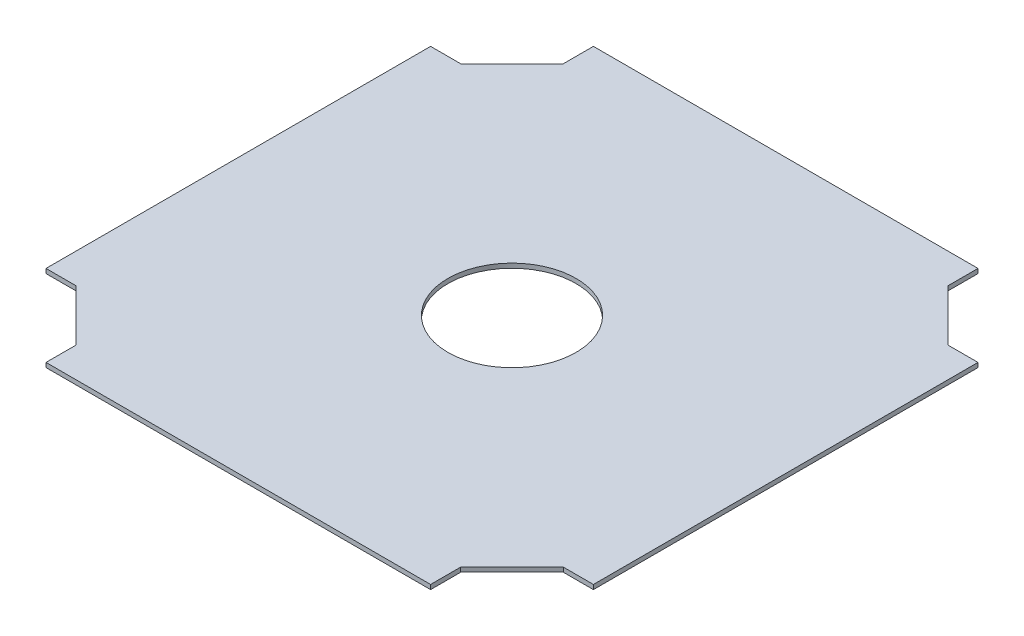
ISO-10303-21;
HEADER;
FILE_DESCRIPTION(('STEP AP214'),'2;1');
FILE_NAME('part.step','',(''),(''),'','','');
FILE_SCHEMA(('AUTOMOTIVE_DESIGN { 1 0 10303 214 1 1 1 1 }'));
ENDSEC;
DATA;
#1=APPLICATION_CONTEXT('core data for automotive mechanical design processes');
#2=APPLICATION_PROTOCOL_DEFINITION('international standard','automotive_design',2000,#1);
#3=PRODUCT_CONTEXT('',#1,'mechanical');
#4=PRODUCT('Part','Part','',(#3));
#5=PRODUCT_RELATED_PRODUCT_CATEGORY('part','',(#4));
#6=PRODUCT_DEFINITION_FORMATION('','',#4);
#7=PRODUCT_DEFINITION_CONTEXT('part definition',#1,'design');
#8=PRODUCT_DEFINITION('design','',#6,#7);
#9=PRODUCT_DEFINITION_SHAPE('','',#8);
#10=(LENGTH_UNIT() NAMED_UNIT(*) SI_UNIT(.MILLI.,.METRE.));
#11=(NAMED_UNIT(*) PLANE_ANGLE_UNIT() SI_UNIT($,.RADIAN.));
#12=(NAMED_UNIT(*) SI_UNIT($,.STERADIAN.) SOLID_ANGLE_UNIT());
#13=UNCERTAINTY_MEASURE_WITH_UNIT(LENGTH_MEASURE(1.E-05),#10,'distance_accuracy_value','');
#14=(GEOMETRIC_REPRESENTATION_CONTEXT(3) GLOBAL_UNCERTAINTY_ASSIGNED_CONTEXT((#13)) GLOBAL_UNIT_ASSIGNED_CONTEXT((#10,
#11,#12)) REPRESENTATION_CONTEXT('',''));
#15=CARTESIAN_POINT('',(0.,0.,0.));
#16=DIRECTION('',(0.,0.,1.));
#17=DIRECTION('',(1.,0.,0.));
#18=AXIS2_PLACEMENT_3D('',#15,#16,#17);
#19=CARTESIAN_POINT('',(-363.5,3.5,-423.5));
#20=DIRECTION('',(1.,0.,0.));
#21=DIRECTION('',(0.,0.,-1.));
#22=AXIS2_PLACEMENT_3D('',#19,#20,#21);
#23=PLANE('',#22);
#24=DIRECTION('',(0.,0.,1.));
#25=VECTOR('',#24,1.);
#26=CARTESIAN_POINT('',(-363.5,0.,-423.5));
#27=LINE('',#26,#25);
#28=CARTESIAN_POINT('',(-363.5,0.,-427.));
#29=VERTEX_POINT('',#28);
#30=CARTESIAN_POINT('',(-363.5,0.,-403.5));
#31=VERTEX_POINT('',#30);
#32=EDGE_CURVE('E109',#29,#31,#27,.T.);
#33=ORIENTED_EDGE('',*,*,#32,.T.);
#34=DIRECTION('',(0.,-1.,0.));
#35=VECTOR('',#34,1.);
#36=CARTESIAN_POINT('',(-363.5,3.5,-403.5));
#37=LINE('',#36,#35);
#38=CARTESIAN_POINT('',(-363.5,3.5,-403.5));
#39=VERTEX_POINT('',#38);
#40=EDGE_CURVE('E11',#39,#31,#37,.T.);
#41=ORIENTED_EDGE('',*,*,#40,.F.);
#42=DIRECTION('',(0.,0.,1.));
#43=VECTOR('',#42,1.);
#44=CARTESIAN_POINT('',(-363.5,3.5,-423.5));
#45=LINE('',#44,#43);
#46=CARTESIAN_POINT('',(-363.5,3.5,-427.));
#47=VERTEX_POINT('',#46);
#48=EDGE_CURVE('E115',#47,#39,#45,.T.);
#49=ORIENTED_EDGE('',*,*,#48,.F.);
#50=DIRECTION('',(0.,-1.,0.));
#51=VECTOR('',#50,1.);
#52=CARTESIAN_POINT('',(-363.5,3.5,-427.));
#53=LINE('',#52,#51);
#54=EDGE_CURVE('E174',#47,#29,#53,.T.);
#55=ORIENTED_EDGE('',*,*,#54,.T.);
#56=EDGE_LOOP('',(#33,#41,#49,#55));
#57=FACE_BOUND('',#56,.T.);
#58=ADVANCED_FACE('F33',(#57),#23,.F.);
#59=CARTESIAN_POINT('',(-363.5,3.5,-403.5));
#60=DIRECTION('',(0.707106781186548,0.,0.707106781186548));
#61=DIRECTION('',(0.707106781186548,0.,-0.707106781186548));
#62=AXIS2_PLACEMENT_3D('',#59,#60,#61);
#63=PLANE('',#62);
#64=DIRECTION('',(-0.707106781186547,0.,0.707106781186547));
#65=VECTOR('',#64,1.);
#66=CARTESIAN_POINT('',(-363.5,0.,-403.5));
#67=LINE('',#66,#65);
#68=CARTESIAN_POINT('',(-403.5,0.,-363.5));
#69=VERTEX_POINT('',#68);
#70=EDGE_CURVE('E179',#31,#69,#67,.T.);
#71=ORIENTED_EDGE('',*,*,#70,.T.);
#72=DIRECTION('',(0.,-1.,0.));
#73=VECTOR('',#72,1.);
#74=CARTESIAN_POINT('',(-403.5,3.5,-363.5));
#75=LINE('',#74,#73);
#76=CARTESIAN_POINT('',(-403.5,3.5,-363.5));
#77=VERTEX_POINT('',#76);
#78=EDGE_CURVE('E42',#77,#69,#75,.T.);
#79=ORIENTED_EDGE('',*,*,#78,.F.);
#80=DIRECTION('',(-0.707106781186547,0.,0.707106781186547));
#81=VECTOR('',#80,1.);
#82=CARTESIAN_POINT('',(-363.5,3.5,-403.5));
#83=LINE('',#82,#81);
#84=EDGE_CURVE('E257',#39,#77,#83,.T.);
#85=ORIENTED_EDGE('',*,*,#84,.F.);
#86=ORIENTED_EDGE('',*,*,#40,.T.);
#87=EDGE_LOOP('',(#71,#79,#85,#86));
#88=FACE_BOUND('',#87,.T.);
#89=ADVANCED_FACE('F256',(#88),#63,.F.);
#90=CARTESIAN_POINT('',(-423.5,3.5,-363.5));
#91=DIRECTION('',(0.,0.,1.));
#92=DIRECTION('',(1.,0.,0.));
#93=AXIS2_PLACEMENT_3D('',#90,#91,#92);
#94=PLANE('',#93);
#95=DIRECTION('',(-1.,0.,0.));
#96=VECTOR('',#95,1.);
#97=CARTESIAN_POINT('',(-423.5,0.,-363.5));
#98=LINE('',#97,#96);
#99=CARTESIAN_POINT('',(-427.,0.,-363.5));
#100=VERTEX_POINT('',#99);
#101=EDGE_CURVE('E182',#69,#100,#98,.T.);
#102=ORIENTED_EDGE('',*,*,#101,.T.);
#103=DIRECTION('',(0.,-1.,0.));
#104=VECTOR('',#103,1.);
#105=CARTESIAN_POINT('',(-427.,3.5,-363.5));
#106=LINE('',#105,#104);
#107=CARTESIAN_POINT('',(-427.,3.5,-363.5));
#108=VERTEX_POINT('',#107);
#109=EDGE_CURVE('E244',#108,#100,#106,.T.);
#110=ORIENTED_EDGE('',*,*,#109,.F.);
#111=DIRECTION('',(-1.,0.,0.));
#112=VECTOR('',#111,1.);
#113=CARTESIAN_POINT('',(-403.5,3.5,-363.5));
#114=LINE('',#113,#112);
#115=EDGE_CURVE('E253',#77,#108,#114,.T.);
#116=ORIENTED_EDGE('',*,*,#115,.F.);
#117=ORIENTED_EDGE('',*,*,#78,.T.);
#118=EDGE_LOOP('',(#102,#110,#116,#117));
#119=FACE_BOUND('',#118,.T.);
#120=ADVANCED_FACE('F251',(#119),#94,.F.);
#121=CARTESIAN_POINT('',(-427.,3.5,-63.5000000000001));
#122=DIRECTION('',(1.,0.,0.));
#123=DIRECTION('',(0.,0.,-1.));
#124=AXIS2_PLACEMENT_3D('',#121,#122,#123);
#125=PLANE('',#124);
#126=DIRECTION('',(0.,0.,1.));
#127=VECTOR('',#126,1.);
#128=CARTESIAN_POINT('',(-427.,0.,-63.5000000000001));
#129=LINE('',#128,#127);
#130=CARTESIAN_POINT('',(-427.,0.,-63.5000000000001));
#131=VERTEX_POINT('',#130);
#132=EDGE_CURVE('E184',#100,#131,#129,.T.);
#133=ORIENTED_EDGE('',*,*,#132,.T.);
#134=DIRECTION('',(0.,-1.,0.));
#135=VECTOR('',#134,1.);
#136=CARTESIAN_POINT('',(-427.,3.5,-63.5000000000001));
#137=LINE('',#136,#135);
#138=CARTESIAN_POINT('',(-427.,3.5,-63.5000000000001));
#139=VERTEX_POINT('',#138);
#140=EDGE_CURVE('E241',#139,#131,#137,.T.);
#141=ORIENTED_EDGE('',*,*,#140,.F.);
#142=DIRECTION('',(0.,0.,1.));
#143=VECTOR('',#142,1.);
#144=CARTESIAN_POINT('',(-427.,3.5,-63.5000000000001));
#145=LINE('',#144,#143);
#146=EDGE_CURVE('E272',#108,#139,#145,.T.);
#147=ORIENTED_EDGE('',*,*,#146,.F.);
#148=ORIENTED_EDGE('',*,*,#109,.T.);
#149=EDGE_LOOP('',(#133,#141,#147,#148));
#150=FACE_BOUND('',#149,.T.);
#151=ADVANCED_FACE('F263',(#150),#125,.F.);
#152=CARTESIAN_POINT('',(-403.5,3.5,-63.5000000000001));
#153=DIRECTION('',(0.,0.,-1.));
#154=DIRECTION('',(-1.,0.,0.));
#155=AXIS2_PLACEMENT_3D('',#152,#153,#154);
#156=PLANE('',#155);
#157=DIRECTION('',(1.,0.,0.));
#158=VECTOR('',#157,1.);
#159=CARTESIAN_POINT('',(-403.5,0.,-63.5000000000001));
#160=LINE('',#159,#158);
#161=CARTESIAN_POINT('',(-403.5,0.,-63.5000000000001));
#162=VERTEX_POINT('',#161);
#163=EDGE_CURVE('E187',#131,#162,#160,.T.);
#164=ORIENTED_EDGE('',*,*,#163,.T.);
#165=DIRECTION('',(0.,-1.,0.));
#166=VECTOR('',#165,1.);
#167=CARTESIAN_POINT('',(-403.5,3.5,-63.5000000000001));
#168=LINE('',#167,#166);
#169=CARTESIAN_POINT('',(-403.5,3.5,-63.5000000000001));
#170=VERTEX_POINT('',#169);
#171=EDGE_CURVE('E238',#170,#162,#168,.T.);
#172=ORIENTED_EDGE('',*,*,#171,.F.);
#173=DIRECTION('',(1.,0.,0.));
#174=VECTOR('',#173,1.);
#175=CARTESIAN_POINT('',(-423.5,3.5,-63.5000000000001));
#176=LINE('',#175,#174);
#177=EDGE_CURVE('E269',#139,#170,#176,.T.);
#178=ORIENTED_EDGE('',*,*,#177,.F.);
#179=ORIENTED_EDGE('',*,*,#140,.T.);
#180=EDGE_LOOP('',(#164,#172,#178,#179));
#181=FACE_BOUND('',#180,.T.);
#182=ADVANCED_FACE('F267',(#181),#156,.F.);
#183=CARTESIAN_POINT('',(-363.5,3.5,-23.5000000000001));
#184=DIRECTION('',(0.707106781186548,0.,-0.707106781186548));
#185=DIRECTION('',(-0.707106781186548,0.,-0.707106781186548));
#186=AXIS2_PLACEMENT_3D('',#183,#184,#185);
#187=PLANE('',#186);
#188=DIRECTION('',(0.707106781186547,0.,0.707106781186547));
#189=VECTOR('',#188,1.);
#190=CARTESIAN_POINT('',(-363.5,0.,-23.5000000000001));
#191=LINE('',#190,#189);
#192=CARTESIAN_POINT('',(-363.5,0.,-23.5000000000001));
#193=VERTEX_POINT('',#192);
#194=EDGE_CURVE('E189',#162,#193,#191,.T.);
#195=ORIENTED_EDGE('',*,*,#194,.T.);
#196=DIRECTION('',(0.,-1.,0.));
#197=VECTOR('',#196,1.);
#198=CARTESIAN_POINT('',(-363.5,3.5,-23.5000000000001));
#199=LINE('',#198,#197);
#200=CARTESIAN_POINT('',(-363.5,3.5,-23.5000000000001));
#201=VERTEX_POINT('',#200);
#202=EDGE_CURVE('E235',#201,#193,#199,.T.);
#203=ORIENTED_EDGE('',*,*,#202,.F.);
#204=DIRECTION('',(0.707106781186547,0.,0.707106781186547));
#205=VECTOR('',#204,1.);
#206=CARTESIAN_POINT('',(-363.5,3.5,-23.5000000000001));
#207=LINE('',#206,#205);
#208=EDGE_CURVE('E271',#170,#201,#207,.T.);
#209=ORIENTED_EDGE('',*,*,#208,.F.);
#210=ORIENTED_EDGE('',*,*,#171,.T.);
#211=EDGE_LOOP('',(#195,#203,#209,#210));
#212=FACE_BOUND('',#211,.T.);
#213=ADVANCED_FACE('F333',(#212),#187,.F.);
#214=CARTESIAN_POINT('',(-363.5,3.5,-3.50000000000011));
#215=DIRECTION('',(1.,0.,0.));
#216=DIRECTION('',(0.,0.,-1.));
#217=AXIS2_PLACEMENT_3D('',#214,#215,#216);
#218=PLANE('',#217);
#219=DIRECTION('',(0.,0.,1.));
#220=VECTOR('',#219,1.);
#221=CARTESIAN_POINT('',(-363.5,0.,-3.50000000000011));
#222=LINE('',#221,#220);
#223=CARTESIAN_POINT('',(-363.5,0.,0.));
#224=VERTEX_POINT('',#223);
#225=EDGE_CURVE('E192',#193,#224,#222,.T.);
#226=ORIENTED_EDGE('',*,*,#225,.T.);
#227=DIRECTION('',(0.,-1.,0.));
#228=VECTOR('',#227,1.);
#229=CARTESIAN_POINT('',(-363.5,3.5,0.));
#230=LINE('',#229,#228);
#231=CARTESIAN_POINT('',(-363.5,3.5,0.));
#232=VERTEX_POINT('',#231);
#233=EDGE_CURVE('E232',#232,#224,#230,.T.);
#234=ORIENTED_EDGE('',*,*,#233,.F.);
#235=DIRECTION('',(0.,0.,1.));
#236=VECTOR('',#235,1.);
#237=CARTESIAN_POINT('',(-363.5,3.5,-3.50000000000011));
#238=LINE('',#237,#236);
#239=EDGE_CURVE('E274',#201,#232,#238,.T.);
#240=ORIENTED_EDGE('',*,*,#239,.F.);
#241=ORIENTED_EDGE('',*,*,#202,.T.);
#242=EDGE_LOOP('',(#226,#234,#240,#241));
#243=FACE_BOUND('',#242,.T.);
#244=ADVANCED_FACE('F336',(#243),#218,.F.);
#245=CARTESIAN_POINT('',(-363.5,3.5,0.));
#246=DIRECTION('',(0.,0.,-1.));
#247=DIRECTION('',(-1.,0.,0.));
#248=AXIS2_PLACEMENT_3D('',#245,#246,#247);
#249=PLANE('',#248);
#250=DIRECTION('',(1.,0.,0.));
#251=VECTOR('',#250,1.);
#252=CARTESIAN_POINT('',(-363.5,0.,0.));
#253=LINE('',#252,#251);
#254=CARTESIAN_POINT('',(-63.4999999999999,0.,0.));
#255=VERTEX_POINT('',#254);
#256=EDGE_CURVE('E194',#224,#255,#253,.T.);
#257=ORIENTED_EDGE('',*,*,#256,.T.);
#258=DIRECTION('',(0.,-1.,0.));
#259=VECTOR('',#258,1.);
#260=CARTESIAN_POINT('',(-63.4999999999999,3.5,0.));
#261=LINE('',#260,#259);
#262=CARTESIAN_POINT('',(-63.4999999999999,3.5,0.));
#263=VERTEX_POINT('',#262);
#264=EDGE_CURVE('E229',#263,#255,#261,.T.);
#265=ORIENTED_EDGE('',*,*,#264,.F.);
#266=DIRECTION('',(1.,0.,0.));
#267=VECTOR('',#266,1.);
#268=CARTESIAN_POINT('',(-363.5,3.5,0.));
#269=LINE('',#268,#267);
#270=EDGE_CURVE('E280',#232,#263,#269,.T.);
#271=ORIENTED_EDGE('',*,*,#270,.F.);
#272=ORIENTED_EDGE('',*,*,#233,.T.);
#273=EDGE_LOOP('',(#257,#265,#271,#272));
#274=FACE_BOUND('',#273,.T.);
#275=ADVANCED_FACE('F340',(#274),#249,.F.);
#276=CARTESIAN_POINT('',(-63.4999999999999,3.5,-3.50000000000011));
#277=DIRECTION('',(-1.,0.,0.));
#278=DIRECTION('',(0.,0.,1.));
#279=AXIS2_PLACEMENT_3D('',#276,#277,#278);
#280=PLANE('',#279);
#281=DIRECTION('',(0.,0.,-1.));
#282=VECTOR('',#281,1.);
#283=CARTESIAN_POINT('',(-63.4999999999999,0.,-3.50000000000011));
#284=LINE('',#283,#282);
#285=CARTESIAN_POINT('',(-63.4999999999999,0.,-23.5000000000001));
#286=VERTEX_POINT('',#285);
#287=EDGE_CURVE('E197',#255,#286,#284,.T.);
#288=ORIENTED_EDGE('',*,*,#287,.T.);
#289=DIRECTION('',(0.,-1.,0.));
#290=VECTOR('',#289,1.);
#291=CARTESIAN_POINT('',(-63.4999999999999,3.5,-23.5000000000001));
#292=LINE('',#291,#290);
#293=CARTESIAN_POINT('',(-63.4999999999999,3.5,-23.5000000000001));
#294=VERTEX_POINT('',#293);
#295=EDGE_CURVE('E226',#294,#286,#292,.T.);
#296=ORIENTED_EDGE('',*,*,#295,.F.);
#297=DIRECTION('',(0.,0.,-1.));
#298=VECTOR('',#297,1.);
#299=CARTESIAN_POINT('',(-63.4999999999999,3.5,-3.50000000000011));
#300=LINE('',#299,#298);
#301=EDGE_CURVE('E282',#263,#294,#300,.T.);
#302=ORIENTED_EDGE('',*,*,#301,.F.);
#303=ORIENTED_EDGE('',*,*,#264,.T.);
#304=EDGE_LOOP('',(#288,#296,#302,#303));
#305=FACE_BOUND('',#304,.T.);
#306=ADVANCED_FACE('F344',(#305),#280,.F.);
#307=CARTESIAN_POINT('',(-63.4999999999999,3.5,-23.5000000000001));
#308=DIRECTION('',(-0.707106781186548,0.,-0.707106781186548));
#309=DIRECTION('',(-0.707106781186548,0.,0.707106781186548));
#310=AXIS2_PLACEMENT_3D('',#307,#308,#309);
#311=PLANE('',#310);
#312=DIRECTION('',(0.707106781186547,0.,-0.707106781186547));
#313=VECTOR('',#312,1.);
#314=CARTESIAN_POINT('',(-63.4999999999999,0.,-23.5000000000001));
#315=LINE('',#314,#313);
#316=CARTESIAN_POINT('',(-23.5,0.,-63.5000000000001));
#317=VERTEX_POINT('',#316);
#318=EDGE_CURVE('E199',#286,#317,#315,.T.);
#319=ORIENTED_EDGE('',*,*,#318,.T.);
#320=DIRECTION('',(0.,-1.,0.));
#321=VECTOR('',#320,1.);
#322=CARTESIAN_POINT('',(-23.5,3.5,-63.5000000000001));
#323=LINE('',#322,#321);
#324=CARTESIAN_POINT('',(-23.5,3.5,-63.5000000000001));
#325=VERTEX_POINT('',#324);
#326=EDGE_CURVE('E223',#325,#317,#323,.T.);
#327=ORIENTED_EDGE('',*,*,#326,.F.);
#328=DIRECTION('',(0.707106781186547,0.,-0.707106781186547));
#329=VECTOR('',#328,1.);
#330=CARTESIAN_POINT('',(-63.4999999999999,3.5,-23.5000000000001));
#331=LINE('',#330,#329);
#332=EDGE_CURVE('E284',#294,#325,#331,.T.);
#333=ORIENTED_EDGE('',*,*,#332,.F.);
#334=ORIENTED_EDGE('',*,*,#295,.T.);
#335=EDGE_LOOP('',(#319,#327,#333,#334));
#336=FACE_BOUND('',#335,.T.);
#337=ADVANCED_FACE('F348',(#336),#311,.F.);
#338=CARTESIAN_POINT('',(-3.49999999999995,3.5,-63.5000000000001));
#339=DIRECTION('',(0.,0.,-1.));
#340=DIRECTION('',(-1.,0.,0.));
#341=AXIS2_PLACEMENT_3D('',#338,#339,#340);
#342=PLANE('',#341);
#343=DIRECTION('',(1.,0.,0.));
#344=VECTOR('',#343,1.);
#345=CARTESIAN_POINT('',(-3.49999999999995,0.,-63.5000000000001));
#346=LINE('',#345,#344);
#347=CARTESIAN_POINT('',(0.,0.,-63.5000000000001));
#348=VERTEX_POINT('',#347);
#349=EDGE_CURVE('E202',#317,#348,#346,.T.);
#350=ORIENTED_EDGE('',*,*,#349,.T.);
#351=DIRECTION('',(0.,-1.,0.));
#352=VECTOR('',#351,1.);
#353=CARTESIAN_POINT('',(0.,3.5,-63.5000000000001));
#354=LINE('',#353,#352);
#355=CARTESIAN_POINT('',(0.,3.5,-63.5000000000001));
#356=VERTEX_POINT('',#355);
#357=EDGE_CURVE('E220',#356,#348,#354,.T.);
#358=ORIENTED_EDGE('',*,*,#357,.F.);
#359=DIRECTION('',(1.,0.,0.));
#360=VECTOR('',#359,1.);
#361=CARTESIAN_POINT('',(-23.5,3.5,-63.5000000000001));
#362=LINE('',#361,#360);
#363=EDGE_CURVE('E286',#325,#356,#362,.T.);
#364=ORIENTED_EDGE('',*,*,#363,.F.);
#365=ORIENTED_EDGE('',*,*,#326,.T.);
#366=EDGE_LOOP('',(#350,#358,#364,#365));
#367=FACE_BOUND('',#366,.T.);
#368=ADVANCED_FACE('F352',(#367),#342,.F.);
#369=CARTESIAN_POINT('',(0.,3.5,-63.5000000000001));
#370=DIRECTION('',(-1.,0.,0.));
#371=DIRECTION('',(0.,0.,1.));
#372=AXIS2_PLACEMENT_3D('',#369,#370,#371);
#373=PLANE('',#372);
#374=DIRECTION('',(0.,0.,-1.));
#375=VECTOR('',#374,1.);
#376=CARTESIAN_POINT('',(0.,0.,-63.5000000000001));
#377=LINE('',#376,#375);
#378=CARTESIAN_POINT('',(0.,0.,-363.5));
#379=VERTEX_POINT('',#378);
#380=EDGE_CURVE('E204',#348,#379,#377,.T.);
#381=ORIENTED_EDGE('',*,*,#380,.T.);
#382=DIRECTION('',(0.,-1.,0.));
#383=VECTOR('',#382,1.);
#384=CARTESIAN_POINT('',(0.,3.5,-363.5));
#385=LINE('',#384,#383);
#386=CARTESIAN_POINT('',(0.,3.5,-363.5));
#387=VERTEX_POINT('',#386);
#388=EDGE_CURVE('E217',#387,#379,#385,.T.);
#389=ORIENTED_EDGE('',*,*,#388,.F.);
#390=DIRECTION('',(0.,0.,-1.));
#391=VECTOR('',#390,1.);
#392=CARTESIAN_POINT('',(0.,3.5,-63.5000000000001));
#393=LINE('',#392,#391);
#394=EDGE_CURVE('E288',#356,#387,#393,.T.);
#395=ORIENTED_EDGE('',*,*,#394,.F.);
#396=ORIENTED_EDGE('',*,*,#357,.T.);
#397=EDGE_LOOP('',(#381,#389,#395,#396));
#398=FACE_BOUND('',#397,.T.);
#399=ADVANCED_FACE('F294',(#398),#373,.F.);
#400=CARTESIAN_POINT('',(-23.5,3.5,-363.5));
#401=DIRECTION('',(0.,0.,1.));
#402=DIRECTION('',(1.,0.,0.));
#403=AXIS2_PLACEMENT_3D('',#400,#401,#402);
#404=PLANE('',#403);
#405=DIRECTION('',(-1.,0.,0.));
#406=VECTOR('',#405,1.);
#407=CARTESIAN_POINT('',(-23.5,0.,-363.5));
#408=LINE('',#407,#406);
#409=CARTESIAN_POINT('',(-23.5,0.,-363.5));
#410=VERTEX_POINT('',#409);
#411=EDGE_CURVE('E207',#379,#410,#408,.T.);
#412=ORIENTED_EDGE('',*,*,#411,.T.);
#413=DIRECTION('',(0.,-1.,0.));
#414=VECTOR('',#413,1.);
#415=CARTESIAN_POINT('',(-23.5,3.5,-363.5));
#416=LINE('',#415,#414);
#417=CARTESIAN_POINT('',(-23.5,3.5,-363.5));
#418=VERTEX_POINT('',#417);
#419=EDGE_CURVE('E169',#418,#410,#416,.T.);
#420=ORIENTED_EDGE('',*,*,#419,.F.);
#421=DIRECTION('',(-1.,0.,0.));
#422=VECTOR('',#421,1.);
#423=CARTESIAN_POINT('',(-3.49999999999995,3.5,-363.5));
#424=LINE('',#423,#422);
#425=EDGE_CURVE('E159',#387,#418,#424,.T.);
#426=ORIENTED_EDGE('',*,*,#425,.F.);
#427=ORIENTED_EDGE('',*,*,#388,.T.);
#428=EDGE_LOOP('',(#412,#420,#426,#427));
#429=FACE_BOUND('',#428,.T.);
#430=ADVANCED_FACE('F297',(#429),#404,.F.);
#431=CARTESIAN_POINT('',(-63.4999999999999,3.5,-403.5));
#432=DIRECTION('',(-0.707106781186548,0.,0.707106781186548));
#433=DIRECTION('',(0.707106781186548,0.,0.707106781186548));
#434=AXIS2_PLACEMENT_3D('',#431,#432,#433);
#435=PLANE('',#434);
#436=DIRECTION('',(-0.707106781186547,0.,-0.707106781186547));
#437=VECTOR('',#436,1.);
#438=CARTESIAN_POINT('',(-63.4999999999999,0.,-403.5));
#439=LINE('',#438,#437);
#440=CARTESIAN_POINT('',(-63.4999999999999,0.,-403.5));
#441=VERTEX_POINT('',#440);
#442=EDGE_CURVE('E168',#410,#441,#439,.T.);
#443=ORIENTED_EDGE('',*,*,#442,.T.);
#444=DIRECTION('',(0.,-1.,0.));
#445=VECTOR('',#444,1.);
#446=CARTESIAN_POINT('',(-63.4999999999999,3.5,-403.5));
#447=LINE('',#446,#445);
#448=CARTESIAN_POINT('',(-63.4999999999999,3.5,-403.5));
#449=VERTEX_POINT('',#448);
#450=EDGE_CURVE('E165',#449,#441,#447,.T.);
#451=ORIENTED_EDGE('',*,*,#450,.F.);
#452=DIRECTION('',(-0.707106781186547,0.,-0.707106781186547));
#453=VECTOR('',#452,1.);
#454=CARTESIAN_POINT('',(-63.4999999999999,3.5,-403.5));
#455=LINE('',#454,#453);
#456=EDGE_CURVE('E153',#418,#449,#455,.T.);
#457=ORIENTED_EDGE('',*,*,#456,.F.);
#458=ORIENTED_EDGE('',*,*,#419,.T.);
#459=EDGE_LOOP('',(#443,#451,#457,#458));
#460=FACE_BOUND('',#459,.T.);
#461=ADVANCED_FACE('F166',(#460),#435,.F.);
#462=CARTESIAN_POINT('',(-63.4999999999999,3.5,-423.5));
#463=DIRECTION('',(-1.,0.,0.));
#464=DIRECTION('',(0.,0.,1.));
#465=AXIS2_PLACEMENT_3D('',#462,#463,#464);
#466=PLANE('',#465);
#467=DIRECTION('',(0.,0.,-1.));
#468=VECTOR('',#467,1.);
#469=CARTESIAN_POINT('',(-63.4999999999999,0.,-423.5));
#470=LINE('',#469,#468);
#471=CARTESIAN_POINT('',(-63.4999999999999,0.,-427.));
#472=VERTEX_POINT('',#471);
#473=EDGE_CURVE('E102',#441,#472,#470,.T.);
#474=ORIENTED_EDGE('',*,*,#473,.T.);
#475=DIRECTION('',(0.,-1.,0.));
#476=VECTOR('',#475,1.);
#477=CARTESIAN_POINT('',(-63.4999999999999,3.5,-427.));
#478=LINE('',#477,#476);
#479=CARTESIAN_POINT('',(-63.4999999999999,3.5,-427.));
#480=VERTEX_POINT('',#479);
#481=EDGE_CURVE('E170',#480,#472,#478,.T.);
#482=ORIENTED_EDGE('',*,*,#481,.F.);
#483=DIRECTION('',(0.,0.,-1.));
#484=VECTOR('',#483,1.);
#485=CARTESIAN_POINT('',(-63.4999999999999,3.5,-423.5));
#486=LINE('',#485,#484);
#487=EDGE_CURVE('E157',#449,#480,#486,.T.);
#488=ORIENTED_EDGE('',*,*,#487,.F.);
#489=ORIENTED_EDGE('',*,*,#450,.T.);
#490=EDGE_LOOP('',(#474,#482,#488,#489));
#491=FACE_BOUND('',#490,.T.);
#492=ADVANCED_FACE('F172',(#491),#466,.F.);
#493=CARTESIAN_POINT('',(-63.4999999999999,3.5,-427.));
#494=DIRECTION('',(0.,0.,1.));
#495=DIRECTION('',(1.,0.,0.));
#496=AXIS2_PLACEMENT_3D('',#493,#494,#495);
#497=PLANE('',#496);
#498=DIRECTION('',(-1.,0.,0.));
#499=VECTOR('',#498,1.);
#500=CARTESIAN_POINT('',(-63.4999999999999,0.,-427.));
#501=LINE('',#500,#499);
#502=EDGE_CURVE('E211',#472,#29,#501,.T.);
#503=ORIENTED_EDGE('',*,*,#502,.T.);
#504=ORIENTED_EDGE('',*,*,#54,.F.);
#505=DIRECTION('',(-1.,0.,0.));
#506=VECTOR('',#505,1.);
#507=CARTESIAN_POINT('',(-63.4999999999999,3.5,-427.));
#508=LINE('',#507,#506);
#509=EDGE_CURVE('E50',#480,#47,#508,.T.);
#510=ORIENTED_EDGE('',*,*,#509,.F.);
#511=ORIENTED_EDGE('',*,*,#481,.T.);
#512=EDGE_LOOP('',(#503,#504,#510,#511));
#513=FACE_BOUND('',#512,.T.);
#514=ADVANCED_FACE('F299',(#513),#497,.F.);
#515=CARTESIAN_POINT('',(0.,3.5,0.));
#516=DIRECTION('',(0.,1.,0.));
#517=DIRECTION('',(0.,0.,1.));
#518=AXIS2_PLACEMENT_3D('',#515,#516,#517);
#519=PLANE('',#518);
#520=CARTESIAN_POINT('',(-213.5,3.5,-213.5));
#521=DIRECTION('',(0.,1.,0.));
#522=DIRECTION('',(0.,0.,1.));
#523=AXIS2_PLACEMENT_3D('',#520,#521,#522);
#524=CIRCLE('',#523,50.);
#525=CARTESIAN_POINT('',(-213.5,3.5,-163.5));
#526=VERTEX_POINT('',#525);
#527=EDGE_CURVE('E304',#526,#526,#524,.T.);
#528=ORIENTED_EDGE('',*,*,#527,.F.);
#529=EDGE_LOOP('',(#528));
#530=FACE_BOUND('',#529,.T.);
#531=ORIENTED_EDGE('',*,*,#48,.T.);
#532=ORIENTED_EDGE('',*,*,#84,.T.);
#533=ORIENTED_EDGE('',*,*,#115,.T.);
#534=ORIENTED_EDGE('',*,*,#146,.T.);
#535=ORIENTED_EDGE('',*,*,#177,.T.);
#536=ORIENTED_EDGE('',*,*,#208,.T.);
#537=ORIENTED_EDGE('',*,*,#239,.T.);
#538=ORIENTED_EDGE('',*,*,#270,.T.);
#539=ORIENTED_EDGE('',*,*,#301,.T.);
#540=ORIENTED_EDGE('',*,*,#332,.T.);
#541=ORIENTED_EDGE('',*,*,#363,.T.);
#542=ORIENTED_EDGE('',*,*,#394,.T.);
#543=ORIENTED_EDGE('',*,*,#425,.T.);
#544=ORIENTED_EDGE('',*,*,#456,.T.);
#545=ORIENTED_EDGE('',*,*,#487,.T.);
#546=ORIENTED_EDGE('',*,*,#509,.T.);
#547=EDGE_LOOP('',(#531,#532,#533,#534,#535,#536,#537,#538,#539,#540,#541,#542,#543,#544,#545,#546));
#548=FACE_BOUND('',#547,.T.);
#549=ADVANCED_FACE('F155',(#530,#548),#519,.T.);
#550=CARTESIAN_POINT('',(0.,0.,0.));
#551=DIRECTION('',(0.,1.,0.));
#552=DIRECTION('',(0.,0.,1.));
#553=AXIS2_PLACEMENT_3D('',#550,#551,#552);
#554=PLANE('',#553);
#555=CARTESIAN_POINT('',(-213.5,0.,-213.5));
#556=DIRECTION('',(0.,1.,0.));
#557=DIRECTION('',(0.,0.,1.));
#558=AXIS2_PLACEMENT_3D('',#555,#556,#557);
#559=CIRCLE('',#558,50.);
#560=CARTESIAN_POINT('',(-213.5,0.,-163.5));
#561=VERTEX_POINT('',#560);
#562=EDGE_CURVE('E36',#561,#561,#559,.T.);
#563=ORIENTED_EDGE('',*,*,#562,.T.);
#564=EDGE_LOOP('',(#563));
#565=FACE_BOUND('',#564,.T.);
#566=ORIENTED_EDGE('',*,*,#32,.F.);
#567=ORIENTED_EDGE('',*,*,#502,.F.);
#568=ORIENTED_EDGE('',*,*,#473,.F.);
#569=ORIENTED_EDGE('',*,*,#442,.F.);
#570=ORIENTED_EDGE('',*,*,#411,.F.);
#571=ORIENTED_EDGE('',*,*,#380,.F.);
#572=ORIENTED_EDGE('',*,*,#349,.F.);
#573=ORIENTED_EDGE('',*,*,#318,.F.);
#574=ORIENTED_EDGE('',*,*,#287,.F.);
#575=ORIENTED_EDGE('',*,*,#256,.F.);
#576=ORIENTED_EDGE('',*,*,#225,.F.);
#577=ORIENTED_EDGE('',*,*,#194,.F.);
#578=ORIENTED_EDGE('',*,*,#163,.F.);
#579=ORIENTED_EDGE('',*,*,#132,.F.);
#580=ORIENTED_EDGE('',*,*,#101,.F.);
#581=ORIENTED_EDGE('',*,*,#70,.F.);
#582=EDGE_LOOP('',(#566,#567,#568,#569,#570,#571,#572,#573,#574,#575,#576,#577,#578,#579,#580,#581));
#583=FACE_BOUND('',#582,.T.);
#584=ADVANCED_FACE('F258',(#565,#583),#554,.F.);
#585=CARTESIAN_POINT('',(-213.5,-6.5,-213.5));
#586=DIRECTION('',(0.,1.,0.));
#587=DIRECTION('',(0.,0.,1.));
#588=AXIS2_PLACEMENT_3D('',#585,#586,#587);
#589=CYLINDRICAL_SURFACE('',#588,50.);
#590=ORIENTED_EDGE('',*,*,#527,.T.);
#591=EDGE_LOOP('',(#590));
#592=FACE_BOUND('',#591,.T.);
#593=ORIENTED_EDGE('',*,*,#562,.F.);
#594=EDGE_LOOP('',(#593));
#595=FACE_BOUND('',#594,.T.);
#596=ADVANCED_FACE('F312',(#592,#595),#589,.F.);
#597=CLOSED_SHELL('',(#58,#89,#120,#151,#182,#213,#244,#275,#306,#337,#368,#399,#430,#461,#492,
#514,#549,#584,#596));
#598=MANIFOLD_SOLID_BREP('B2',#597);
#599=ADVANCED_BREP_SHAPE_REPRESENTATION('',(#18,#598),#14);
#600=SHAPE_DEFINITION_REPRESENTATION(#9,#599);
ENDSEC;
END-ISO-10303-21;
